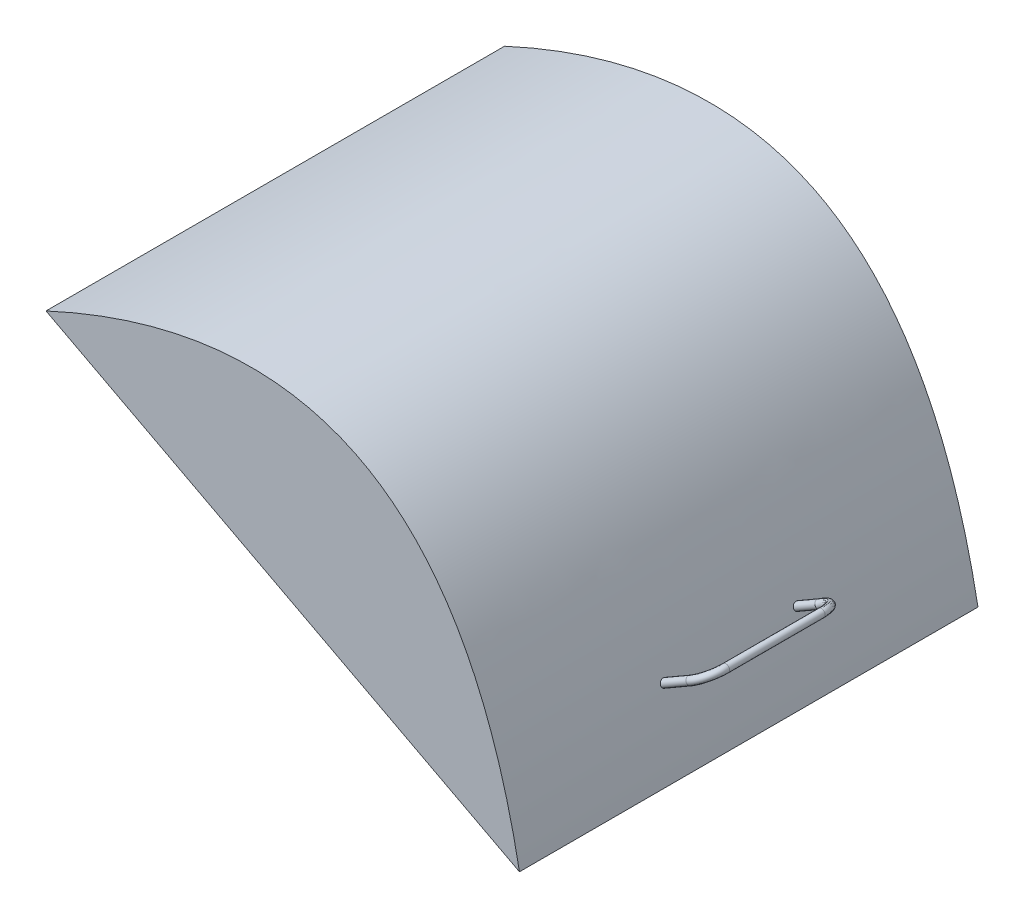
ISO-10303-21;
HEADER;
FILE_DESCRIPTION(('STEP AP214'),'2;1');
FILE_NAME('part.step','',(''),(''),'','','');
FILE_SCHEMA(('AUTOMOTIVE_DESIGN { 1 0 10303 214 1 1 1 1 }'));
ENDSEC;
DATA;
#1=APPLICATION_CONTEXT('core data for automotive mechanical design processes');
#2=APPLICATION_PROTOCOL_DEFINITION('international standard','automotive_design',2000,#1);
#3=PRODUCT_CONTEXT('',#1,'mechanical');
#4=PRODUCT('Part','Part','',(#3));
#5=PRODUCT_RELATED_PRODUCT_CATEGORY('part','',(#4));
#6=PRODUCT_DEFINITION_FORMATION('','',#4);
#7=PRODUCT_DEFINITION_CONTEXT('part definition',#1,'design');
#8=PRODUCT_DEFINITION('design','',#6,#7);
#9=PRODUCT_DEFINITION_SHAPE('','',#8);
#10=(LENGTH_UNIT() NAMED_UNIT(*) SI_UNIT(.MILLI.,.METRE.));
#11=(NAMED_UNIT(*) PLANE_ANGLE_UNIT() SI_UNIT($,.RADIAN.));
#12=(NAMED_UNIT(*) SI_UNIT($,.STERADIAN.) SOLID_ANGLE_UNIT());
#13=UNCERTAINTY_MEASURE_WITH_UNIT(LENGTH_MEASURE(1.E-05),#10,'distance_accuracy_value','');
#14=(GEOMETRIC_REPRESENTATION_CONTEXT(3) GLOBAL_UNCERTAINTY_ASSIGNED_CONTEXT((#13)) GLOBAL_UNIT_ASSIGNED_CONTEXT((#10,
#11,#12)) REPRESENTATION_CONTEXT('',''));
#15=CARTESIAN_POINT('',(0.,0.,0.));
#16=DIRECTION('',(0.,0.,1.));
#17=DIRECTION('',(1.,0.,0.));
#18=AXIS2_PLACEMENT_3D('',#15,#16,#17);
#19=CARTESIAN_POINT('',(169.392654495738,345.174398533907,85.4049866440416));
#20=DIRECTION('',(0.866025403784182,0.500000000000445,0.));
#21=DIRECTION('',(0.,0.,1.));
#22=AXIS2_PLACEMENT_3D('',#19,#20,#21);
#23=PLANE('',#22);
#24=CARTESIAN_POINT('',(169.392654495738,345.174398533907,85.4049866440416));
#25=DIRECTION('',(0.866025403784182,0.500000000000445,0.));
#26=DIRECTION('',(0.,0.,1.));
#27=AXIS2_PLACEMENT_3D('',#24,#25,#26);
#28=CIRCLE('',#27,2.);
#29=CARTESIAN_POINT('',(169.392654495738,345.174398533907,87.4049866440416));
#30=VERTEX_POINT('',#29);
#31=EDGE_CURVE('E56',#30,#30,#28,.T.);
#32=ORIENTED_EDGE('',*,*,#31,.F.);
#33=EDGE_LOOP('',(#32));
#34=FACE_BOUND('',#33,.T.);
#35=ADVANCED_FACE('F53',(#34),#23,.F.);
#36=CARTESIAN_POINT('',(171.752718795463,346.53698229266,155.026497024515));
#37=DIRECTION('',(-0.866025403784182,-0.500000000000445,0.));
#38=DIRECTION('',(0.,0.,-1.));
#39=AXIS2_PLACEMENT_3D('',#36,#37,#38);
#40=PLANE('',#39);
#41=CARTESIAN_POINT('',(171.752718795463,346.53698229266,155.026497024515));
#42=DIRECTION('',(-0.866025403784182,-0.500000000000445,0.));
#43=DIRECTION('',(0.,0.,-1.));
#44=AXIS2_PLACEMENT_3D('',#41,#42,#43);
#45=CIRCLE('',#44,2.);
#46=CARTESIAN_POINT('',(171.752718795463,346.53698229266,153.026497024515));
#47=VERTEX_POINT('',#46);
#48=EDGE_CURVE('E127',#47,#47,#45,.T.);
#49=ORIENTED_EDGE('',*,*,#48,.T.);
#50=EDGE_LOOP('',(#49));
#51=FACE_BOUND('',#50,.T.);
#52=ADVANCED_FACE('F96',(#51),#40,.T.);
#53=CARTESIAN_POINT('',(191.394506900875,357.877173942698,85.4049866440416));
#54=DIRECTION('',(-0.866025403784182,-0.500000000000445,0.));
#55=DIRECTION('',(0.,0.,-1.));
#56=AXIS2_PLACEMENT_3D('',#53,#54,#55);
#57=CYLINDRICAL_SURFACE('',#56,2.);
#58=CARTESIAN_POINT('',(190.043289590342,359.406449341487,85.4049866440416));
#59=CARTESIAN_POINT('',(190.04260921939,359.406056565863,85.3993296845175));
#60=CARTESIAN_POINT('',(190.04194112454,359.405643121115,85.3936724034912));
#61=CARTESIAN_POINT('',(190.034742390658,359.400878063683,85.3315708355269));
#62=CARTESIAN_POINT('',(190.029423793604,359.394491967449,85.275117671177));
#63=CARTESIAN_POINT('',(190.02128006455,359.377651832021,85.1626250980715));
#64=CARTESIAN_POINT('',(190.018456174048,359.367195771125,85.1065859090717));
#65=CARTESIAN_POINT('',(190.015322471865,359.342254041506,84.9952067498873));
#66=CARTESIAN_POINT('',(190.015018038723,359.327759820216,84.9398685272714));
#67=CARTESIAN_POINT('',(190.016937862887,359.294842792658,84.8303868411896));
#68=CARTESIAN_POINT('',(190.019164086642,359.276416940358,84.7762443402062));
#69=CARTESIAN_POINT('',(190.029613466344,359.21548811276,84.6164265111004));
#70=CARTESIAN_POINT('',(190.041599809201,359.167272517129,84.5130876575634));
#71=CARTESIAN_POINT('',(190.075287945767,359.056896969929,84.3158667888915));
#72=CARTESIAN_POINT('',(190.096989712508,358.994737057066,84.2219847475077));
#73=CARTESIAN_POINT('',(190.136235309414,358.892571177824,84.09058467458));
#74=CARTESIAN_POINT('',(190.150400303428,358.857102057554,84.0484245180335));
#75=CARTESIAN_POINT('',(190.18085132053,358.783417008311,83.9674596699997));
#76=CARTESIAN_POINT('',(190.197135289675,358.745203755124,83.9286517889549));
#77=CARTESIAN_POINT('',(190.231722558646,358.666252332118,83.8546309534483));
#78=CARTESIAN_POINT('',(190.250026798096,358.625512991316,83.8194196865472));
#79=CARTESIAN_POINT('',(190.288509503362,358.541817722087,83.7528715152657));
#80=CARTESIAN_POINT('',(190.308688388038,358.498861299249,83.7215354804062));
#81=CARTESIAN_POINT('',(190.371465249858,358.367859074777,83.6342134404861));
#82=CARTESIAN_POINT('',(190.41662950733,358.276937244357,83.5842184289896));
#83=CARTESIAN_POINT('',(190.512430647086,358.090163132978,83.501974208557));
#84=CARTESIAN_POINT('',(190.563067187697,357.994311160036,83.4697238924666));
#85=CARTESIAN_POINT('',(190.668007148537,357.801020495208,83.4240457281099));
#86=CARTESIAN_POINT('',(190.722283423013,357.703596938686,83.4104919292018));
#87=CARTESIAN_POINT('',(190.833240747732,357.509327540067,83.4022150560154));
#88=CARTESIAN_POINT('',(190.889921743471,357.412481684933,83.4074915551845));
#89=CARTESIAN_POINT('',(191.003901941823,357.222419986879,83.4366718696842));
#90=CARTESIAN_POINT('',(191.061198731274,357.129193972207,83.4605188157286));
#91=CARTESIAN_POINT('',(191.174965431227,356.948716776565,83.5260520794379));
#92=CARTESIAN_POINT('',(191.231435328764,356.861465689189,83.5677386764778));
#93=CARTESIAN_POINT('',(191.342115287241,356.695214113845,83.6678587907002));
#94=CARTESIAN_POINT('',(191.396321298837,356.616228058879,83.7263209578932));
#95=CARTESIAN_POINT('',(191.47466985129,356.505838692921,83.8251491091383));
#96=CARTESIAN_POINT('',(191.500296688446,356.470385237915,83.8599544385383));
#97=CARTESIAN_POINT('',(191.550442474844,356.402347353399,83.9330757492622));
#98=CARTESIAN_POINT('',(191.574960370474,356.369765625569,83.9713949687034));
#99=CARTESIAN_POINT('',(191.646809002508,356.276415563135,84.0915932643005));
#100=CARTESIAN_POINT('',(191.692196423639,356.220378157768,84.1784118273397));
#101=CARTESIAN_POINT('',(191.776512990475,356.122576964263,84.3625875964518));
#102=CARTESIAN_POINT('',(191.815441763549,356.080813999538,84.4599454100499));
#103=CARTESIAN_POINT('',(191.868529230066,356.029427749228,84.612579759112));
#104=CARTESIAN_POINT('',(191.88546607271,356.014091461151,84.6650511704869));
#105=CARTESIAN_POINT('',(191.91729623044,355.98750398612,84.7715852793754));
#106=CARTESIAN_POINT('',(191.932191304705,355.976249268565,84.8256465576572));
#107=CARTESIAN_POINT('',(191.959829650113,355.957905053909,84.9349160831918));
#108=CARTESIAN_POINT('',(191.972576256363,355.950809057925,84.9901224005187));
#109=CARTESIAN_POINT('',(191.995862638403,355.940799441441,85.1013637823094));
#110=CARTESIAN_POINT('',(192.006402645831,355.937885381752,85.1573987591226));
#111=CARTESIAN_POINT('',(192.025493007257,355.93623282328,85.2716217449548));
#112=CARTESIAN_POINT('',(192.033973760892,355.937622918328,85.3298237162607));
#113=CARTESIAN_POINT('',(192.041917151819,355.941583030849,85.3936724143558));
#114=CARTESIAN_POINT('',(192.042609252909,355.941954895598,85.3993296956281));
#115=CARTESIAN_POINT('',(192.043289590344,355.94234772635,85.4049866440416));
#116=B_SPLINE_CURVE_WITH_KNOTS('',3,(#58,#59,#60,#61,#62,#63,#64,#65,#66,#67,#68,#69,#70,#71,
#72,#73,#74,#75,#76,#77,#78,#79,#80,#81,#82,#83,#84,#85,#86,#87,#88,#89,#90,#91,#92,#93,#94,#95,
#96,#97,#98,#99,#100,#101,#102,#103,#104,#105,#106,#107,#108,#109,#110,#111,#112,#113,#114,
#115),.UNSPECIFIED.,.F.,.F.,(4,2,2,2,2,2,2,2,2,2,2,2,2,2,2,2,2,2,2,2,2,2,2,2,2,2,2,2,4),(0.,
0.017134498403006,0.188087222103637,0.359124972938215,0.530527761291245,0.702063829369501,
1.04430638059621,1.38654798185264,1.55703889029705,1.72736575436417,1.89777217357084,
2.06821675929971,2.40594166831695,2.74364550309564,3.07906307079059,3.41447304050397,
3.74885988601162,4.0832519683213,4.41821857329784,4.58575828085766,4.75345396148575,
5.09035626880199,5.42727800688882,5.59879690442851,5.77016708036181,5.94126873502974,
6.11235241924336,6.28859631014118,6.30573080854406),.UNSPECIFIED.);
#117=CARTESIAN_POINT('',(190.043289590342,359.406449341487,85.4049866440416));
#118=VERTEX_POINT('',#117);
#119=CARTESIAN_POINT('',(192.043289590344,355.94234772635,85.4049866440416));
#120=VERTEX_POINT('',#119);
#121=EDGE_CURVE('E12',#118,#120,#116,.T.);
#122=ORIENTED_EDGE('',*,*,#121,.T.);
#123=CARTESIAN_POINT('',(190.043289590342,359.406449341487,85.4049866440416));
#124=CARTESIAN_POINT('',(190.043969927941,359.406842171356,85.4106436038812));
#125=CARTESIAN_POINT('',(190.044662318403,359.407214203169,85.4163008384296));
#126=CARTESIAN_POINT('',(190.052403888694,359.411074226115,85.4784751030243));
#127=CARTESIAN_POINT('',(190.060640699908,359.412506551354,85.5349964323084));
#128=CARTESIAN_POINT('',(190.079453213427,359.411202620139,85.6476148552194));
#129=CARTESIAN_POINT('',(190.090030081283,359.408464282319,85.7037117229767));
#130=CARTESIAN_POINT('',(190.113475853076,359.398820942457,85.815196098074));
#131=CARTESIAN_POINT('',(190.126349619559,359.391907025148,85.8705818279341));
#132=CARTESIAN_POINT('',(190.154288505119,359.373949218917,85.9801483717962));
#133=CARTESIAN_POINT('',(190.169355319344,359.362902124728,86.0343282159989));
#134=CARTESIAN_POINT('',(190.217631808351,359.323703326056,86.1942398654615));
#135=CARTESIAN_POINT('',(190.253976152534,359.289469826957,86.2976219378018));
#136=CARTESIAN_POINT('',(190.333997254526,359.205669759014,86.4949057464414));
#137=CARTESIAN_POINT('',(190.377673990066,359.156103236736,86.5888075115312));
#138=CARTESIAN_POINT('',(190.447611077375,359.071480358325,86.7202492576574));
#139=CARTESIAN_POINT('',(190.471619084625,359.041615731831,86.7624354971319));
#140=CARTESIAN_POINT('',(190.520954425935,358.978667182805,86.8434449237918));
#141=CARTESIAN_POINT('',(190.546280469114,358.945586383603,86.8822713059186));
#142=CARTESIAN_POINT('',(190.598101561226,358.87639907543,86.9563206820453));
#143=CARTESIAN_POINT('',(190.624597147458,358.84029116878,86.9915419946533));
#144=CARTESIAN_POINT('',(190.678553706173,358.765324347132,87.0581005522069));
#145=CARTESIAN_POINT('',(190.706014892664,358.726464820327,87.0894369290701));
#146=CARTESIAN_POINT('',(190.789030871893,358.606914276087,87.1766904313791));
#147=CARTESIAN_POINT('',(190.845753170596,358.522536417589,87.2266148298414));
#148=CARTESIAN_POINT('',(190.96056783218,358.346471148921,87.3086923370859));
#149=CARTESIAN_POINT('',(191.018660095945,358.254784266425,87.3408467274404));
#150=CARTESIAN_POINT('',(191.134085099801,358.067478181745,87.3862634455072));
#151=CARTESIAN_POINT('',(191.191420126613,357.971898335069,87.3996817098944));
#152=CARTESIAN_POINT('',(191.304169654693,357.778841521656,87.4077135809598));
#153=CARTESIAN_POINT('',(191.359584210682,357.681364609099,87.4023277238901));
#154=CARTESIAN_POINT('',(191.466700361495,357.487679967579,87.3729735301313));
#155=CARTESIAN_POINT('',(191.518415712264,357.391468753199,87.3490784187541));
#156=CARTESIAN_POINT('',(191.616910753289,357.202659619613,87.2835205385239));
#157=CARTESIAN_POINT('',(191.663690389943,357.110061739657,87.2418575767308));
#158=CARTESIAN_POINT('',(191.751133121837,356.930822596886,87.1418366935766));
#159=CARTESIAN_POINT('',(191.79178232414,356.844195098373,87.0834416963418));
#160=CARTESIAN_POINT('',(191.847186964101,356.720819291354,86.984758948201));
#161=CARTESIAN_POINT('',(191.864729700609,356.680781495051,86.9500089029654));
#162=CARTESIAN_POINT('',(191.897879128022,356.60308791307,86.8770120306323));
#163=CARTESIAN_POINT('',(191.91348396792,356.565434421358,86.838761920045));
#164=CARTESIAN_POINT('',(191.957674456854,356.455320781139,86.7178982340268));
#165=CARTESIAN_POINT('',(191.983048826606,356.387015133853,86.6302171698072));
#166=CARTESIAN_POINT('',(192.024559325763,356.263429211255,86.4441412807598));
#167=CARTESIAN_POINT('',(192.040694939127,356.208149663632,86.3457458578353));
#168=CARTESIAN_POINT('',(192.057675420097,356.136113127707,86.1922912278866));
#169=CARTESIAN_POINT('',(192.062132623117,356.113897283443,86.140105297951));
#170=CARTESIAN_POINT('',(192.068607587033,356.073256576667,86.034169362401));
#171=CARTESIAN_POINT('',(192.070627504598,356.054828374599,85.9804207827219));
#172=CARTESIAN_POINT('',(192.072219570703,356.021898306526,85.8717947329926));
#173=CARTESIAN_POINT('',(192.071795599848,356.007390254123,85.8169191904372));
#174=CARTESIAN_POINT('',(192.068516081555,355.982358049488,85.706347253069));
#175=CARTESIAN_POINT('',(192.065660774735,355.971833503177,85.6506509400199));
#176=CARTESIAN_POINT('',(192.057428348028,355.954607508993,85.5372956646268));
#177=CARTESIAN_POINT('',(192.051985335899,355.948016743557,85.479624262659));
#178=CARTESIAN_POINT('',(192.044638343274,355.943154112234,85.4163008311828));
#179=CARTESIAN_POINT('',(192.043969958987,355.942740500426,85.4106435964647));
#180=CARTESIAN_POINT('',(192.043289590344,355.94234772635,85.4049866440416));
#181=B_SPLINE_CURVE_WITH_KNOTS('',3,(#123,#124,#125,#126,#127,#128,#129,#130,#131,#132,#133,
#134,#135,#136,#137,#138,#139,#140,#141,#142,#143,#144,#145,#146,#147,#148,#149,#150,#151,#152,
#153,#154,#155,#156,#157,#158,#159,#160,#161,#162,#163,#164,#165,#166,#167,#168,#169,#170,#171,
#172,#173,#174,#175,#176,#177,#178,#179,#180),.UNSPECIFIED.,.F.,.F.,(4,2,2,2,2,2,2,2,2,2,2,2,2,
2,2,2,2,2,2,2,2,2,2,2,2,2,2,2,4),(0.,0.0171344983683523,0.188310495546679,0.35957194594358,
0.531200355281466,0.702962138738706,1.04564073624631,1.38831829305243,1.55911885858421,
1.72975518026643,1.90047072693476,2.07122435122097,2.40925348867047,2.74725824429096,
3.0824327445379,3.41759768642655,3.751443396901,4.0852927326804,4.41988763031882,
4.5872467235797,4.7547644620727,5.09505542825662,5.43536539990332,5.60587626569309,
5.77623614135454,5.94632558036446,6.11639818841117,6.29105448286707,6.30818898123541),.UNSPECIFIED.);
#182=EDGE_CURVE('E61',#118,#120,#181,.T.);
#183=ORIENTED_EDGE('',*,*,#182,.F.);
#184=EDGE_LOOP('',(#122,#183));
#185=FACE_BOUND('',#184,.T.);
#186=ORIENTED_EDGE('',*,*,#31,.T.);
#187=EDGE_LOOP('',(#186));
#188=FACE_BOUND('',#187,.T.);
#189=ADVANCED_FACE('F71',(#185,#188),#57,.T.);
#190=CARTESIAN_POINT('',(171.752718795463,346.53698229266,155.026497024515));
#191=DIRECTION('',(0.866025403784182,0.500000000000445,0.));
#192=DIRECTION('',(0.,0.,1.));
#193=AXIS2_PLACEMENT_3D('',#190,#191,#192);
#194=CYLINDRICAL_SURFACE('',#193,2.);
#195=CARTESIAN_POINT('',(193.403353890067,359.036982292671,155.026497024515));
#196=DIRECTION('',(-0.866025403784182,-0.500000000000445,0.));
#197=DIRECTION('',(0.,0.,-1.));
#198=AXIS2_PLACEMENT_3D('',#195,#196,#197);
#199=CIRCLE('',#198,2.);
#200=CARTESIAN_POINT('',(193.403353890067,359.036982292671,157.026497024515));
#201=VERTEX_POINT('',#200);
#202=EDGE_CURVE('E125',#201,#201,#199,.T.);
#203=ORIENTED_EDGE('',*,*,#202,.T.);
#204=EDGE_LOOP('',(#203));
#205=FACE_BOUND('',#204,.T.);
#206=ORIENTED_EDGE('',*,*,#48,.F.);
#207=EDGE_LOOP('',(#206));
#208=FACE_BOUND('',#207,.T.);
#209=ADVANCED_FACE('F95',(#205,#208),#194,.T.);
#210=CARTESIAN_POINT('',(193.403353890067,359.036982292671,145.026497024515));
#211=DIRECTION('',(-0.500000000000445,0.866025403784182,0.));
#212=DIRECTION('',(0.,0.,-1.));
#213=AXIS2_PLACEMENT_3D('',#210,#211,#212);
#214=TOROIDAL_SURFACE('',#213,10.,2.);
#215=CARTESIAN_POINT('',(202.063607927909,364.036982292675,145.026497024515));
#216=DIRECTION('',(0.,0.,1.));
#217=DIRECTION('',(-0.866025403784182,-0.500000000000445,0.));
#218=AXIS2_PLACEMENT_3D('',#215,#216,#217);
#219=CIRCLE('',#218,2.);
#220=CARTESIAN_POINT('',(203.795658735477,365.036982292676,145.026497024515));
#221=VERTEX_POINT('',#220);
#222=EDGE_CURVE('E75',#221,#221,#219,.T.);
#223=CARTESIAN_POINT('',(193.403353890067,359.036982292671,145.026497024515));
#224=DIRECTION('',(-0.500000000000445,0.866025403784182,0.));
#225=DIRECTION('',(0.,0.,-1.));
#226=AXIS2_PLACEMENT_3D('',#223,#224,#225);
#227=CIRCLE('',#226,12.);
#228=EDGE_CURVE('',#201,#221,#227,.T.);
#229=ORIENTED_EDGE('',*,*,#202,.F.);
#230=ORIENTED_EDGE('',*,*,#222,.T.);
#231=ORIENTED_EDGE('',*,*,#228,.T.);
#232=ORIENTED_EDGE('',*,*,#228,.F.);
#233=EDGE_LOOP('',(#229,#231,#230,#232));
#234=FACE_BOUND('',#233,.T.);
#235=ADVANCED_FACE('F109',(#234),#214,.T.);
#236=CARTESIAN_POINT('',(202.063607927909,364.036982292675,145.026497024515));
#237=DIRECTION('',(0.,0.,-1.));
#238=DIRECTION('',(0.866025403784182,0.500000000000445,0.));
#239=AXIS2_PLACEMENT_3D('',#236,#237,#238);
#240=CYLINDRICAL_SURFACE('',#239,2.);
#241=CARTESIAN_POINT('',(202.063607927909,364.036982292675,95.0264970245147));
#242=DIRECTION('',(0.,0.,1.));
#243=DIRECTION('',(-0.866025403784182,-0.500000000000445,0.));
#244=AXIS2_PLACEMENT_3D('',#241,#242,#243);
#245=CIRCLE('',#244,2.);
#246=CARTESIAN_POINT('',(200.331557120341,363.036982292674,95.0264970245147));
#247=VERTEX_POINT('',#246);
#248=EDGE_CURVE('E73',#247,#247,#245,.T.);
#249=ORIENTED_EDGE('',*,*,#248,.T.);
#250=EDGE_LOOP('',(#249));
#251=FACE_BOUND('',#250,.T.);
#252=ORIENTED_EDGE('',*,*,#222,.F.);
#253=EDGE_LOOP('',(#252));
#254=FACE_BOUND('',#253,.T.);
#255=ADVANCED_FACE('F105',(#251,#254),#240,.T.);
#256=CARTESIAN_POINT('',(200.331557120341,363.036982292674,95.0264970245147));
#257=CARTESIAN_POINT('',(200.331557120341,363.036982292674,94.8533591356065));
#258=CARTESIAN_POINT('',(200.327710293371,363.034761326088,94.7187097922537));
#259=CARTESIAN_POINT('',(200.312336744235,363.025885403356,94.411444445776));
#260=CARTESIAN_POINT('',(200.300809866982,363.019230357671,94.2580662422653));
#261=CARTESIAN_POINT('',(200.25476333612,362.992645380682,93.7994452636618));
#262=CARTESIAN_POINT('',(200.208763640505,362.966087444036,93.4957161858089));
#263=CARTESIAN_POINT('',(200.025772941943,362.860437714963,92.5967252066562));
#264=CARTESIAN_POINT('',(199.843639423978,362.755282879336,92.0138689480376));
#265=CARTESIAN_POINT('',(199.131161349373,362.343933471171,90.3604327980839));
#266=CARTESIAN_POINT('',(198.432327319611,361.940461455969,89.3877830978941));
#267=CARTESIAN_POINT('',(196.731317209831,360.958382811192,87.9026820393552));
#268=CARTESIAN_POINT('',(195.730415515783,360.3805119487,87.3913433322008));
#269=CARTESIAN_POINT('',(194.158532247028,359.472984720349,87.0503718721953));
#270=CARTESIAN_POINT('',(193.623321486566,359.163980643722,87.0068676409784));
#271=CARTESIAN_POINT('',(192.824441387906,358.70274700371,87.0485342814316));
#272=CARTESIAN_POINT('',(192.558836087255,358.549399711881,87.0801895531622));
#273=CARTESIAN_POINT('',(192.164117320574,358.321508725684,87.1540083658937));
#274=CARTESIAN_POINT('',(192.033158347759,358.245899527476,87.1830001733834));
#275=CARTESIAN_POINT('',(191.772891364341,358.095634314538,87.2496630571801));
#276=CARTESIAN_POINT('',(191.659619538754,358.030236795544,87.2820932551635));
#277=CARTESIAN_POINT('',(191.413924596307,357.888384754383,87.3624419316333));
#278=CARTESIAN_POINT('',(191.290019717018,357.816848238971,87.4029683144539));
#279=CARTESIAN_POINT('',(191.177378350379,357.751814715621,87.4398081116071));
#280=CARTESIAN_POINT('',(202.331557120343,359.572880677538,95.0264970245147));
#281=CARTESIAN_POINT('',(202.331557120343,359.572880677538,94.8533591356065));
#282=CARTESIAN_POINT('',(202.327710293373,359.570659710951,94.7187097922537));
#283=CARTESIAN_POINT('',(202.312336744237,359.561783788219,94.411444445776));
#284=CARTESIAN_POINT('',(202.300809866984,359.555128742534,94.2580662422653));
#285=CARTESIAN_POINT('',(202.254763336122,359.528543765545,93.7994452636618));
#286=CARTESIAN_POINT('',(202.208763640507,359.5019858289,93.4957161858089));
#287=CARTESIAN_POINT('',(202.025772941945,359.396336099826,92.5967252066562));
#288=CARTESIAN_POINT('',(201.843639423979,359.2911812642,92.0138689480376));
#289=CARTESIAN_POINT('',(201.131161349375,358.879831856034,90.3604327980839));
#290=CARTESIAN_POINT('',(200.432327319613,358.476359840832,89.3877830978941));
#291=CARTESIAN_POINT('',(198.731317209833,357.494281196055,87.9026820393552));
#292=CARTESIAN_POINT('',(197.730415515785,356.916410333564,87.3913433322008));
#293=CARTESIAN_POINT('',(196.15853224703,356.008883105212,87.0503718721953));
#294=CARTESIAN_POINT('',(195.623321486567,355.699879028586,87.0068676409784));
#295=CARTESIAN_POINT('',(194.824441387907,355.238645388573,87.0485342814316));
#296=CARTESIAN_POINT('',(194.558836087257,355.085298096745,87.0801895531623));
#297=CARTESIAN_POINT('',(194.164117320576,354.857407110547,87.1540083658937));
#298=CARTESIAN_POINT('',(194.033158347761,354.781797912339,87.1830001733834));
#299=CARTESIAN_POINT('',(193.772891364343,354.631532699402,87.2496630571801));
#300=CARTESIAN_POINT('',(193.659619538756,354.566135180407,87.2820932551635));
#301=CARTESIAN_POINT('',(193.413924596309,354.424283139246,87.3624419316333));
#302=CARTESIAN_POINT('',(193.290019717019,354.352746623835,87.402968314454));
#303=CARTESIAN_POINT('',(193.177378350381,354.287713100484,87.4398081116072));
#304=CARTESIAN_POINT('',(205.795658735479,361.572880677539,95.0264970245147));
#305=CARTESIAN_POINT('',(205.795658735479,361.572880677539,94.8148840491824));
#306=CARTESIAN_POINT('',(205.789888495023,361.569549227659,94.5648161761225));
#307=CARTESIAN_POINT('',(205.766828171323,361.556235343563,94.1039181564073));
#308=CARTESIAN_POINT('',(205.749537855443,361.546252775035,93.873850851142));
#309=CARTESIAN_POINT('',(205.680468059143,361.506375309548,93.1859193832327));
#310=CARTESIAN_POINT('',(205.611468515726,361.466538404582,92.7303257664587));
#311=CARTESIAN_POINT('',(205.336982467883,361.308063810972,91.3818392977216));
#312=CARTESIAN_POINT('',(205.063782190934,361.150331557532,90.5075549098018));
#313=CARTESIAN_POINT('',(203.995065079027,360.533307445284,88.0274006848632));
#314=CARTESIAN_POINT('',(202.946814034381,359.928099422479,86.5684261345731));
#315=CARTESIAN_POINT('',(200.39529886972,358.454981455319,84.3407745467861));
#316=CARTESIAN_POINT('',(198.893946328648,357.588175161581,83.5737664860331));
#317=CARTESIAN_POINT('',(196.536121425508,356.22688431905,83.0623092960409));
#318=CARTESIAN_POINT('',(195.733305284816,355.763378204111,82.9970529492102));
#319=CARTESIAN_POINT('',(194.534985136827,355.071527744093,83.0595529098901));
#320=CARTESIAN_POINT('',(194.136577185851,354.84150680635,83.1070358174887));
#321=CARTESIAN_POINT('',(193.54449903583,354.499670327053,83.2177640365818));
#322=CARTESIAN_POINT('',(193.348060576607,354.386256529742,83.2612517478177));
#323=CARTESIAN_POINT('',(192.95766010148,354.160858710335,83.3612460735127));
#324=CARTESIAN_POINT('',(192.747664529722,354.039617710452,83.4230022523425));
#325=CARTESIAN_POINT('',(192.447370291089,353.866242750941,83.5212044359043));
#326=CARTESIAN_POINT('',(192.34599399713,353.807713120334,83.5543641622647));
#327=CARTESIAN_POINT('',(192.233352630492,353.742679596983,83.5912039594179));
#328=CARTESIAN_POINT('',(203.795658735478,365.036982292676,95.0264970245147));
#329=CARTESIAN_POINT('',(203.795658735478,365.036982292676,94.8148840491824));
#330=CARTESIAN_POINT('',(203.789888495021,365.033650842795,94.5648161761226));
#331=CARTESIAN_POINT('',(203.766828171321,365.0203369587,94.1039181564073));
#332=CARTESIAN_POINT('',(203.749537855441,365.010354390172,93.873850851142));
#333=CARTESIAN_POINT('',(203.680468059141,364.970476924685,93.1859193832327));
#334=CARTESIAN_POINT('',(203.611468515724,364.930640019719,92.7303257664587));
#335=CARTESIAN_POINT('',(203.336982467881,364.772165426108,91.3818392977216));
#336=CARTESIAN_POINT('',(203.063782190933,364.614433172669,90.5075549098018));
#337=CARTESIAN_POINT('',(201.995065079026,363.997409060421,88.0274006848631));
#338=CARTESIAN_POINT('',(200.946814034379,363.392201037615,86.5684261345731));
#339=CARTESIAN_POINT('',(198.395298869718,361.919083070455,84.3407745467861));
#340=CARTESIAN_POINT('',(196.893946328646,361.052276776718,83.5737664860331));
#341=CARTESIAN_POINT('',(194.536121425507,359.690985934187,83.0623092960409));
#342=CARTESIAN_POINT('',(193.733305284814,359.227479819248,82.9970529492102));
#343=CARTESIAN_POINT('',(192.534985136825,358.53562935923,83.0595529098901));
#344=CARTESIAN_POINT('',(192.136577185849,358.305608421486,83.1070358174887));
#345=CARTESIAN_POINT('',(191.544499035828,357.96377194219,83.2177640365818));
#346=CARTESIAN_POINT('',(191.348060576605,357.850358144878,83.2612517478177));
#347=CARTESIAN_POINT('',(190.957660101479,357.624960325472,83.3612460735127));
#348=CARTESIAN_POINT('',(190.74766452972,357.503719325588,83.4230022523425));
#349=CARTESIAN_POINT('',(190.447370291087,357.330344366077,83.5212044359042));
#350=CARTESIAN_POINT('',(190.345993997128,357.27181473547,83.5543641622647));
#351=CARTESIAN_POINT('',(190.23335263049,357.20678121212,83.5912039594179));
#352=CARTESIAN_POINT('',(201.795658735476,368.501083907813,95.0264970245147));
#353=CARTESIAN_POINT('',(201.795658735476,368.501083907813,94.8148840491824));
#354=CARTESIAN_POINT('',(201.789888495019,368.497752457932,94.5648161761225));
#355=CARTESIAN_POINT('',(201.766828171319,368.484438573836,94.1039181564073));
#356=CARTESIAN_POINT('',(201.74953785544,368.474456005309,93.873850851142));
#357=CARTESIAN_POINT('',(201.68046805914,368.434578539822,93.1859193832327));
#358=CARTESIAN_POINT('',(201.611468515722,368.394741634856,92.7303257664587));
#359=CARTESIAN_POINT('',(201.33698246788,368.236267041245,91.3818392977216));
#360=CARTESIAN_POINT('',(201.063782190931,368.078534787806,90.5075549098018));
#361=CARTESIAN_POINT('',(199.995065079024,367.461510675558,88.0274006848632));
#362=CARTESIAN_POINT('',(198.946814034377,366.856302652752,86.5684261345731));
#363=CARTESIAN_POINT('',(196.395298869716,365.383184685592,84.3407745467861));
#364=CARTESIAN_POINT('',(194.893946328644,364.516378391855,83.5737664860331));
#365=CARTESIAN_POINT('',(192.536121425505,363.155087549323,83.0623092960409));
#366=CARTESIAN_POINT('',(191.733305284813,362.691581434384,82.9970529492102));
#367=CARTESIAN_POINT('',(190.534985136823,361.999730974367,83.0595529098901));
#368=CARTESIAN_POINT('',(190.136577185847,361.769710036623,83.1070358174887));
#369=CARTESIAN_POINT('',(189.544499035826,361.427873557327,83.2177640365818));
#370=CARTESIAN_POINT('',(189.348060576603,361.314459760015,83.2612517478177));
#371=CARTESIAN_POINT('',(188.957660101477,361.089061940609,83.3612460735127));
#372=CARTESIAN_POINT('',(188.747664529718,360.967820940725,83.4230022523425));
#373=CARTESIAN_POINT('',(188.447370291085,360.794445981214,83.5212044359043));
#374=CARTESIAN_POINT('',(188.345993997126,360.735916350607,83.5543641622647));
#375=CARTESIAN_POINT('',(188.233352630488,360.670882827257,83.5912039594179));
#376=CARTESIAN_POINT('',(198.331557120339,366.501083907811,95.0264970245147));
#377=CARTESIAN_POINT('',(198.331557120339,366.501083907811,94.8533591356065));
#378=CARTESIAN_POINT('',(198.32771029337,366.498862941225,94.7187097922537));
#379=CARTESIAN_POINT('',(198.312336744233,366.489987018493,94.411444445776));
#380=CARTESIAN_POINT('',(198.30080986698,366.483331972807,94.2580662422653));
#381=CARTESIAN_POINT('',(198.254763336118,366.456746995819,93.7994452636618));
#382=CARTESIAN_POINT('',(198.208763640503,366.430189059173,93.4957161858089));
#383=CARTESIAN_POINT('',(198.025772941942,366.324539330099,92.5967252066562));
#384=CARTESIAN_POINT('',(197.843639423976,366.219384494473,92.0138689480376));
#385=CARTESIAN_POINT('',(197.131161349371,365.808035086308,90.3604327980839));
#386=CARTESIAN_POINT('',(196.43232731961,365.404563071106,89.3877830978941));
#387=CARTESIAN_POINT('',(194.73131720983,364.422484426329,87.9026820393552));
#388=CARTESIAN_POINT('',(193.730415515781,363.844613563837,87.3913433322008));
#389=CARTESIAN_POINT('',(192.158532247027,362.937086335486,87.0503718721953));
#390=CARTESIAN_POINT('',(191.623321486564,362.628082258859,87.0068676409784));
#391=CARTESIAN_POINT('',(190.824441387904,362.166848618847,87.0485342814316));
#392=CARTESIAN_POINT('',(190.558836087254,362.013501327018,87.0801895531623));
#393=CARTESIAN_POINT('',(190.164117320573,361.78561034082,87.1540083658937));
#394=CARTESIAN_POINT('',(190.033158347757,361.710001142613,87.1830001733834));
#395=CARTESIAN_POINT('',(189.77289136434,361.559735929675,87.2496630571801));
#396=CARTESIAN_POINT('',(189.659619538752,361.49433841068,87.2820932551635));
#397=CARTESIAN_POINT('',(189.413924596305,361.35248636952,87.3624419316333));
#398=CARTESIAN_POINT('',(189.290019717016,361.280949854108,87.402968314454));
#399=CARTESIAN_POINT('',(189.177378350378,361.215916330758,87.4398081116072));
#400=CARTESIAN_POINT('',(200.331557120341,363.036982292674,95.0264970245147));
#401=CARTESIAN_POINT('',(200.331557120341,363.036982292674,94.8533591356065));
#402=CARTESIAN_POINT('',(200.327710293371,363.034761326088,94.7187097922537));
#403=CARTESIAN_POINT('',(200.312336744235,363.025885403356,94.411444445776));
#404=CARTESIAN_POINT('',(200.300809866982,363.019230357671,94.2580662422653));
#405=CARTESIAN_POINT('',(200.25476333612,362.992645380682,93.7994452636618));
#406=CARTESIAN_POINT('',(200.208763640505,362.966087444036,93.4957161858089));
#407=CARTESIAN_POINT('',(200.025772941943,362.860437714963,92.5967252066562));
#408=CARTESIAN_POINT('',(199.843639423978,362.755282879336,92.0138689480376));
#409=CARTESIAN_POINT('',(199.131161349373,362.343933471171,90.3604327980839));
#410=CARTESIAN_POINT('',(198.432327319611,361.940461455969,89.3877830978941));
#411=CARTESIAN_POINT('',(196.731317209831,360.958382811192,87.9026820393552));
#412=CARTESIAN_POINT('',(195.730415515783,360.3805119487,87.3913433322008));
#413=CARTESIAN_POINT('',(194.158532247028,359.472984720349,87.0503718721953));
#414=CARTESIAN_POINT('',(193.623321486566,359.163980643722,87.0068676409784));
#415=CARTESIAN_POINT('',(192.824441387906,358.70274700371,87.0485342814316));
#416=CARTESIAN_POINT('',(192.558836087255,358.549399711881,87.0801895531622));
#417=CARTESIAN_POINT('',(192.164117320574,358.321508725684,87.1540083658937));
#418=CARTESIAN_POINT('',(192.033158347759,358.245899527476,87.1830001733834));
#419=CARTESIAN_POINT('',(191.772891364341,358.095634314538,87.2496630571801));
#420=CARTESIAN_POINT('',(191.659619538754,358.030236795544,87.2820932551635));
#421=CARTESIAN_POINT('',(191.413924596307,357.888384754383,87.3624419316333));
#422=CARTESIAN_POINT('',(191.290019717018,357.816848238971,87.4029683144539));
#423=CARTESIAN_POINT('',(191.177378350379,357.751814715621,87.4398081116071));
#424=(BOUNDED_SURFACE() B_SPLINE_SURFACE(3,3,((#256,#257,#258,#259,#260,#261,#262,#263,#264,
#265,#266,#267,#268,#269,#270,#271,#272,#273,#274,#275,#276,#277,#278,#279),(#280,#281,#282,
#283,#284,#285,#286,#287,#288,#289,#290,#291,#292,#293,#294,#295,#296,#297,#298,#299,#300,#301,
#302,#303),(#304,#305,#306,#307,#308,#309,#310,#311,#312,#313,#314,#315,#316,#317,#318,#319,
#320,#321,#322,#323,#324,#325,#326,#327),(#328,#329,#330,#331,#332,#333,#334,#335,#336,#337,
#338,#339,#340,#341,#342,#343,#344,#345,#346,#347,#348,#349,#350,#351),(#352,#353,#354,#355,
#356,#357,#358,#359,#360,#361,#362,#363,#364,#365,#366,#367,#368,#369,#370,#371,#372,#373,#374,
#375),(#376,#377,#378,#379,#380,#381,#382,#383,#384,#385,#386,#387,#388,#389,#390,#391,#392,
#393,#394,#395,#396,#397,#398,#399),(#400,#401,#402,#403,#404,#405,#406,#407,#408,#409,#410,
#411,#412,#413,#414,#415,#416,#417,#418,#419,#420,#421,#422,#423)),.UNSPECIFIED.,.T.,.F.,
.F.) B_SPLINE_SURFACE_WITH_KNOTS((4,3,4),(4,2,2,2,2,2,2,2,2,2,2,4),(0.,0.5,1.),
(0.830841570676776,0.836127771593127,0.841413972509477,0.851986374342179,0.873131178007582,
0.915420785338388,0.957710392669194,0.978855196334597,0.989427598167298,0.994713799083649,1.,
1.00371337663686),.UNSPECIFIED.) GEOMETRIC_REPRESENTATION_ITEM() RATIONAL_B_SPLINE_SURFACE(((1.,
1.,1.,1.,1.,1.,1.,1.,1.,1.,1.,1.,1.,1.,1.,1.,1.,1.,1.,1.,1.,1.,1.,1.),(0.333333333333333,
0.333333333333333,0.333333333333333,0.333333333333333,0.333333333333333,0.333333333333333,
0.333333333333333,0.333333333333333,0.333333333333333,0.333333333333333,0.333333333333333,
0.333333333333333,0.333333333333333,0.333333333333333,0.333333333333333,0.333333333333333,
0.333333333333333,0.333333333333333,0.333333333333333,0.333333333333333,0.333333333333333,
0.333333333333333,0.333333333333333,0.333333333333333),(0.333333333333333,0.333333333333333,
0.333333333333333,0.333333333333333,0.333333333333333,0.333333333333333,0.333333333333333,
0.333333333333333,0.333333333333333,0.333333333333333,0.333333333333333,0.333333333333333,
0.333333333333333,0.333333333333333,0.333333333333333,0.333333333333333,0.333333333333333,
0.333333333333333,0.333333333333333,0.333333333333333,0.333333333333333,0.333333333333333,
0.333333333333333,0.333333333333333),(1.,1.,1.,1.,1.,1.,1.,1.,1.,1.,1.,1.,1.,1.,1.,1.,1.,1.,1.,
1.,1.,1.,1.,1.),(0.333333333333333,0.333333333333333,0.333333333333333,0.333333333333333,
0.333333333333333,0.333333333333333,0.333333333333333,0.333333333333333,0.333333333333333,
0.333333333333333,0.333333333333333,0.333333333333333,0.333333333333333,0.333333333333333,
0.333333333333333,0.333333333333333,0.333333333333333,0.333333333333333,0.333333333333333,
0.333333333333333,0.333333333333333,0.333333333333333,0.333333333333333,0.333333333333333),
(0.333333333333333,0.333333333333333,0.333333333333333,0.333333333333333,0.333333333333333,
0.333333333333333,0.333333333333333,0.333333333333333,0.333333333333333,0.333333333333333,
0.333333333333333,0.333333333333333,0.333333333333333,0.333333333333333,0.333333333333333,
0.333333333333333,0.333333333333333,0.333333333333333,0.333333333333333,0.333333333333333,
0.333333333333333,0.333333333333333,0.333333333333333,0.333333333333333),(1.,1.,1.,1.,1.,1.,1.,
1.,1.,1.,1.,1.,1.,1.,1.,1.,1.,1.,1.,1.,1.,1.,1.,1.))) REPRESENTATION_ITEM('') SURFACE());
#425=ORIENTED_EDGE('',*,*,#182,.T.);
#426=ORIENTED_EDGE('',*,*,#121,.F.);
#427=EDGE_LOOP('',(#425,#426));
#428=FACE_BOUND('',#427,.T.);
#429=ORIENTED_EDGE('',*,*,#248,.F.);
#430=EDGE_LOOP('',(#429));
#431=FACE_BOUND('',#430,.T.);
#432=ADVANCED_FACE('F68',(#428,#431),#424,.F.);
#433=CLOSED_SHELL('',(#35,#52,#189,#209,#235,#255,#432));
#434=MANIFOLD_SOLID_BREP('B2',#433);
#435=CARTESIAN_POINT('',(189.005424092318,312.63453937486,240.));
#436=CARTESIAN_POINT('',(146.359795428968,537.99508443126,240.));
#437=CARTESIAN_POINT('',(-58.8146032159298,442.961950401625,240.));
#438=B_SPLINE_CURVE_WITH_KNOTS('',2,(#435,#436,#437),.UNSPECIFIED.,.F.,.F.,(3,3),(0.,1.),.UNSPECIFIED.);
#439=DIRECTION('',(0.,0.,-1.));
#440=VECTOR('',#439,1.);
#441=SURFACE_OF_LINEAR_EXTRUSION('',#438,#440);
#442=CARTESIAN_POINT('',(189.005424092318,312.63453937486,0.));
#443=CARTESIAN_POINT('',(146.359795428968,537.99508443126,0.));
#444=CARTESIAN_POINT('',(-58.8146032159298,442.961950401625,0.));
#445=B_SPLINE_CURVE_WITH_KNOTS('',2,(#442,#443,#444),.UNSPECIFIED.,.F.,.F.,(3,3),(0.,1.),.UNSPECIFIED.);
#446=CARTESIAN_POINT('',(189.005424092318,312.63453937486,0.));
#447=VERTEX_POINT('',#446);
#448=CARTESIAN_POINT('',(-58.8146032159298,442.961950401625,0.));
#449=VERTEX_POINT('',#448);
#450=EDGE_CURVE('E234',#447,#449,#445,.T.);
#451=ORIENTED_EDGE('',*,*,#450,.T.);
#452=DIRECTION('',(0.,0.,-1.));
#453=VECTOR('',#452,1.);
#454=CARTESIAN_POINT('',(-58.8146032159298,442.961950401625,240.));
#455=LINE('',#454,#453);
#456=CARTESIAN_POINT('',(-58.8146032159298,442.961950401625,240.));
#457=VERTEX_POINT('',#456);
#458=EDGE_CURVE('E51',#457,#449,#455,.T.);
#459=ORIENTED_EDGE('',*,*,#458,.F.);
#460=CARTESIAN_POINT('',(189.005424092318,312.63453937486,240.));
#461=VERTEX_POINT('',#460);
#462=EDGE_CURVE('E233',#461,#457,#438,.T.);
#463=ORIENTED_EDGE('',*,*,#462,.F.);
#464=DIRECTION('',(0.,0.,-1.));
#465=VECTOR('',#464,1.);
#466=CARTESIAN_POINT('',(189.005424092318,312.63453937486,240.));
#467=LINE('',#466,#465);
#468=EDGE_CURVE('E211',#461,#447,#467,.T.);
#469=ORIENTED_EDGE('',*,*,#468,.T.);
#470=EDGE_LOOP('',(#451,#459,#463,#469));
#471=FACE_BOUND('',#470,.T.);
#472=ADVANCED_FACE('F202',(#471),#441,.F.);
#473=CARTESIAN_POINT('',(-58.8146032159298,442.961950401625,240.));
#474=DIRECTION('',(0.465455039381305,0.885071526100884,0.));
#475=DIRECTION('',(-0.885071526100884,0.465455039381305,0.));
#476=AXIS2_PLACEMENT_3D('',#473,#474,#475);
#477=PLANE('',#476);
#478=CARTESIAN_POINT('',(-58.8146032159298,442.961950401625,0.));
#479=CARTESIAN_POINT('',(189.005424092318,312.63453937486,0.));
#480=B_SPLINE_CURVE_WITH_KNOTS('',1,(#478,#479),.UNSPECIFIED.,.F.,.F.,(2,2),(0.,1.),.UNSPECIFIED.);
#481=EDGE_CURVE('E226',#449,#447,#480,.T.);
#482=ORIENTED_EDGE('',*,*,#481,.T.);
#483=ORIENTED_EDGE('',*,*,#468,.F.);
#484=CARTESIAN_POINT('',(-58.8146032159298,442.961950401625,240.));
#485=CARTESIAN_POINT('',(189.005424092318,312.63453937486,240.));
#486=B_SPLINE_CURVE_WITH_KNOTS('',1,(#484,#485),.UNSPECIFIED.,.F.,.F.,(2,2),(0.,1.),.UNSPECIFIED.);
#487=EDGE_CURVE('E218',#457,#461,#486,.T.);
#488=ORIENTED_EDGE('',*,*,#487,.F.);
#489=ORIENTED_EDGE('',*,*,#458,.T.);
#490=EDGE_LOOP('',(#482,#483,#488,#489));
#491=FACE_BOUND('',#490,.T.);
#492=ADVANCED_FACE('F229',(#491),#477,.F.);
#493=CARTESIAN_POINT('',(105.727602933581,457.896664659751,240.));
#494=DIRECTION('',(0.,0.,1.));
#495=DIRECTION('',(0.998629534754571,0.052335956242999,0.));
#496=AXIS2_PLACEMENT_3D('',#493,#494,#495);
#497=PLANE('',#496);
#498=ORIENTED_EDGE('',*,*,#462,.T.);
#499=ORIENTED_EDGE('',*,*,#487,.T.);
#500=EDGE_LOOP('',(#498,#499));
#501=FACE_BOUND('',#500,.T.);
#502=ADVANCED_FACE('F261',(#501),#497,.T.);
#503=CARTESIAN_POINT('',(105.727602933581,457.896664659751,0.));
#504=DIRECTION('',(0.,0.,1.));
#505=DIRECTION('',(0.998629534754571,0.052335956242999,0.));
#506=AXIS2_PLACEMENT_3D('',#503,#504,#505);
#507=PLANE('',#506);
#508=ORIENTED_EDGE('',*,*,#450,.F.);
#509=ORIENTED_EDGE('',*,*,#481,.F.);
#510=EDGE_LOOP('',(#508,#509));
#511=FACE_BOUND('',#510,.T.);
#512=ADVANCED_FACE('F237',(#511),#507,.F.);
#513=CLOSED_SHELL('',(#472,#492,#502,#512));
#514=MANIFOLD_SOLID_BREP('B6',#513);
#515=ADVANCED_BREP_SHAPE_REPRESENTATION('',(#18,#434,#514),#14);
#516=SHAPE_DEFINITION_REPRESENTATION(#9,#515);
ENDSEC;
END-ISO-10303-21;
